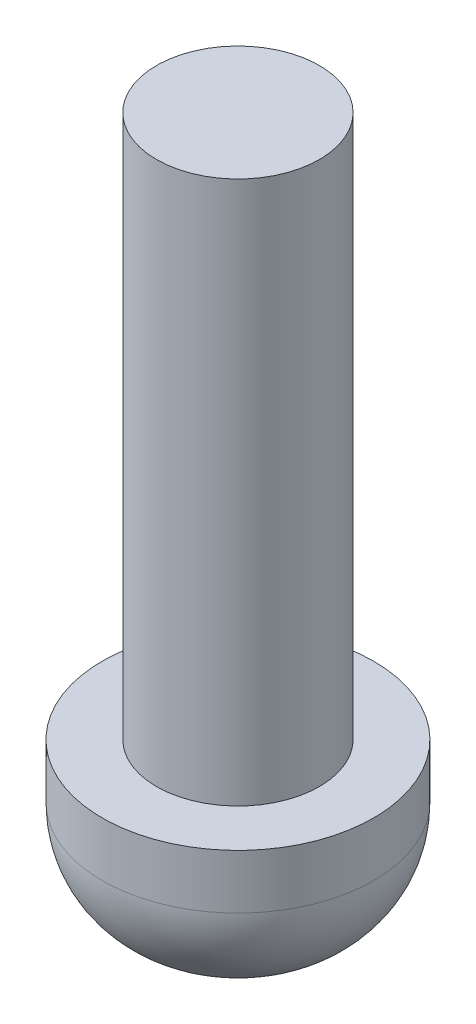
ISO-10303-21;
HEADER;
FILE_DESCRIPTION(('STEP AP214'),'2;1');
FILE_NAME('part.step','',(''),(''),'','','');
FILE_SCHEMA(('AUTOMOTIVE_DESIGN { 1 0 10303 214 1 1 1 1 }'));
ENDSEC;
DATA;
#1=APPLICATION_CONTEXT('core data for automotive mechanical design processes');
#2=APPLICATION_PROTOCOL_DEFINITION('international standard','automotive_design',2000,#1);
#3=PRODUCT_CONTEXT('',#1,'mechanical');
#4=PRODUCT('Part','Part','',(#3));
#5=PRODUCT_RELATED_PRODUCT_CATEGORY('part','',(#4));
#6=PRODUCT_DEFINITION_FORMATION('','',#4);
#7=PRODUCT_DEFINITION_CONTEXT('part definition',#1,'design');
#8=PRODUCT_DEFINITION('design','',#6,#7);
#9=PRODUCT_DEFINITION_SHAPE('','',#8);
#10=(LENGTH_UNIT() NAMED_UNIT(*) SI_UNIT(.MILLI.,.METRE.));
#11=(NAMED_UNIT(*) PLANE_ANGLE_UNIT() SI_UNIT($,.RADIAN.));
#12=(NAMED_UNIT(*) SI_UNIT($,.STERADIAN.) SOLID_ANGLE_UNIT());
#13=UNCERTAINTY_MEASURE_WITH_UNIT(LENGTH_MEASURE(1.E-05),#10,'distance_accuracy_value','');
#14=(GEOMETRIC_REPRESENTATION_CONTEXT(3) GLOBAL_UNCERTAINTY_ASSIGNED_CONTEXT((#13)) GLOBAL_UNIT_ASSIGNED_CONTEXT((#10,
#11,#12)) REPRESENTATION_CONTEXT('',''));
#15=CARTESIAN_POINT('',(0.,0.,0.));
#16=DIRECTION('',(0.,0.,1.));
#17=DIRECTION('',(1.,0.,0.));
#18=AXIS2_PLACEMENT_3D('',#15,#16,#17);
#19=CARTESIAN_POINT('',(0.,-3.,0.));
#20=DIRECTION('',(0.,1.,0.));
#21=DIRECTION('',(0.,0.,1.));
#22=AXIS2_PLACEMENT_3D('',#19,#20,#21);
#23=CYLINDRICAL_SURFACE('',#22,0.5);
#24=CARTESIAN_POINT('',(0.,-3.,0.));
#25=DIRECTION('',(0.,1.,0.));
#26=DIRECTION('',(0.,0.,1.));
#27=AXIS2_PLACEMENT_3D('',#24,#25,#26);
#28=CIRCLE('',#27,0.5);
#29=CARTESIAN_POINT('',(-0.417386632650925,-3.,0.275296928577712));
#30=VERTEX_POINT('',#29);
#31=CARTESIAN_POINT('',(-0.275296928577712,-3.,0.417386632650925));
#32=VERTEX_POINT('',#31);
#33=EDGE_CURVE('E148',#30,#32,#28,.T.);
#34=ORIENTED_EDGE('',*,*,#33,.F.);
#35=DIRECTION('',(0.,1.,0.));
#36=VECTOR('',#35,1.);
#37=CARTESIAN_POINT('',(-0.417386632650925,-3.,0.275296928577712));
#38=LINE('',#37,#36);
#39=CARTESIAN_POINT('',(-0.417386632650925,-1.,0.275296928577712));
#40=VERTEX_POINT('',#39);
#41=EDGE_CURVE('E123',#40,#30,#38,.F.);
#42=ORIENTED_EDGE('',*,*,#41,.F.);
#43=CARTESIAN_POINT('',(0.,-1.,0.));
#44=DIRECTION('',(0.,1.,0.));
#45=DIRECTION('',(0.,0.,1.));
#46=AXIS2_PLACEMENT_3D('',#43,#44,#45);
#47=CIRCLE('',#46,0.5);
#48=CARTESIAN_POINT('',(-0.275296928577712,-1.,0.417386632650925));
#49=VERTEX_POINT('',#48);
#50=EDGE_CURVE('E119',#40,#49,#47,.T.);
#51=ORIENTED_EDGE('',*,*,#50,.T.);
#52=DIRECTION('',(0.,1.,0.));
#53=VECTOR('',#52,1.);
#54=CARTESIAN_POINT('',(-0.275296928577712,-3.,0.417386632650925));
#55=LINE('',#54,#53);
#56=EDGE_CURVE('E124',#49,#32,#55,.F.);
#57=ORIENTED_EDGE('',*,*,#56,.T.);
#58=EDGE_LOOP('',(#34,#42,#51,#57));
#59=FACE_BOUND('',#58,.T.);
#60=ADVANCED_FACE('F17',(#59),#23,.F.);
#61=CARTESIAN_POINT('',(0.,-3.,0.));
#62=DIRECTION('',(0.,1.,0.));
#63=DIRECTION('',(0.,0.,1.));
#64=AXIS2_PLACEMENT_3D('',#61,#62,#63);
#65=CYLINDRICAL_SURFACE('',#64,0.5);
#66=CARTESIAN_POINT('',(0.,-3.,0.));
#67=DIRECTION('',(0.,1.,0.));
#68=DIRECTION('',(0.,0.,1.));
#69=AXIS2_PLACEMENT_3D('',#66,#67,#68);
#70=CIRCLE('',#69,0.5);
#71=CARTESIAN_POINT('',(-0.275296928577712,-3.,-0.417386632650925));
#72=VERTEX_POINT('',#71);
#73=CARTESIAN_POINT('',(-0.417386632650925,-3.,-0.275296928577712));
#74=VERTEX_POINT('',#73);
#75=EDGE_CURVE('E142',#72,#74,#70,.T.);
#76=ORIENTED_EDGE('',*,*,#75,.F.);
#77=DIRECTION('',(0.,1.,0.));
#78=VECTOR('',#77,1.);
#79=CARTESIAN_POINT('',(-0.275296928577712,-3.,-0.417386632650925));
#80=LINE('',#79,#78);
#81=CARTESIAN_POINT('',(-0.275296928577712,-1.,-0.417386632650925));
#82=VERTEX_POINT('',#81);
#83=EDGE_CURVE('E256',#82,#72,#80,.F.);
#84=ORIENTED_EDGE('',*,*,#83,.F.);
#85=CARTESIAN_POINT('',(0.,-1.,0.));
#86=DIRECTION('',(0.,1.,0.));
#87=DIRECTION('',(0.,0.,1.));
#88=AXIS2_PLACEMENT_3D('',#85,#86,#87);
#89=CIRCLE('',#88,0.5);
#90=CARTESIAN_POINT('',(-0.417386632650925,-1.,-0.275296928577712));
#91=VERTEX_POINT('',#90);
#92=EDGE_CURVE('E238',#82,#91,#89,.T.);
#93=ORIENTED_EDGE('',*,*,#92,.T.);
#94=DIRECTION('',(0.,1.,0.));
#95=VECTOR('',#94,1.);
#96=CARTESIAN_POINT('',(-0.417386632650925,-3.,-0.275296928577712));
#97=LINE('',#96,#95);
#98=EDGE_CURVE('E137',#91,#74,#97,.F.);
#99=ORIENTED_EDGE('',*,*,#98,.T.);
#100=EDGE_LOOP('',(#76,#84,#93,#99));
#101=FACE_BOUND('',#100,.T.);
#102=ADVANCED_FACE('F322',(#101),#65,.F.);
#103=CARTESIAN_POINT('',(0.,-3.,0.));
#104=DIRECTION('',(0.,1.,0.));
#105=DIRECTION('',(0.,0.,1.));
#106=AXIS2_PLACEMENT_3D('',#103,#104,#105);
#107=CYLINDRICAL_SURFACE('',#106,0.5);
#108=CARTESIAN_POINT('',(0.,-1.,0.));
#109=DIRECTION('',(0.,1.,0.));
#110=DIRECTION('',(0.,0.,1.));
#111=AXIS2_PLACEMENT_3D('',#108,#109,#110);
#112=CIRCLE('',#111,0.5);
#113=CARTESIAN_POINT('',(0.417386632650925,-1.,-0.275296928577712));
#114=VERTEX_POINT('',#113);
#115=CARTESIAN_POINT('',(0.275296928577712,-1.,-0.417386632650925));
#116=VERTEX_POINT('',#115);
#117=EDGE_CURVE('E22',#114,#116,#112,.T.);
#118=ORIENTED_EDGE('',*,*,#117,.T.);
#119=DIRECTION('',(0.,1.,0.));
#120=VECTOR('',#119,1.);
#121=CARTESIAN_POINT('',(0.275296928577712,-3.,-0.417386632650925));
#122=LINE('',#121,#120);
#123=CARTESIAN_POINT('',(0.275296928577712,-3.,-0.417386632650925));
#124=VERTEX_POINT('',#123);
#125=EDGE_CURVE('E252',#116,#124,#122,.F.);
#126=ORIENTED_EDGE('',*,*,#125,.T.);
#127=CARTESIAN_POINT('',(0.,-3.,0.));
#128=DIRECTION('',(0.,1.,0.));
#129=DIRECTION('',(0.,0.,1.));
#130=AXIS2_PLACEMENT_3D('',#127,#128,#129);
#131=CIRCLE('',#130,0.5);
#132=CARTESIAN_POINT('',(0.417386632650925,-3.,-0.275296928577712));
#133=VERTEX_POINT('',#132);
#134=EDGE_CURVE('E241',#133,#124,#131,.T.);
#135=ORIENTED_EDGE('',*,*,#134,.F.);
#136=DIRECTION('',(0.,1.,0.));
#137=VECTOR('',#136,1.);
#138=CARTESIAN_POINT('',(0.417386632650925,-3.,-0.275296928577712));
#139=LINE('',#138,#137);
#140=EDGE_CURVE('E287',#114,#133,#139,.F.);
#141=ORIENTED_EDGE('',*,*,#140,.F.);
#142=EDGE_LOOP('',(#118,#126,#135,#141));
#143=FACE_BOUND('',#142,.T.);
#144=ADVANCED_FACE('F320',(#143),#107,.F.);
#145=CARTESIAN_POINT('',(-0.0764702213901551,-1.,1.11261669727155));
#146=DIRECTION('',(0.,1.,0.));
#147=DIRECTION('',(0.,0.,1.));
#148=AXIS2_PLACEMENT_3D('',#145,#146,#147);
#149=PLANE('',#148);
#150=DIRECTION('',(0.186616509751668,0.,0.982432836527824));
#151=VECTOR('',#150,1.);
#152=CARTESIAN_POINT('',(-0.275296928577712,-1.,0.417386632650924));
#153=LINE('',#152,#151);
#154=CARTESIAN_POINT('',(0.,-1.,1.86667288706595));
#155=VERTEX_POINT('',#154);
#156=EDGE_CURVE('E237',#155,#49,#153,.F.);
#157=ORIENTED_EDGE('',*,*,#156,.T.);
#158=ORIENTED_EDGE('',*,*,#50,.F.);
#159=DIRECTION('',(-0.982432836527824,0.,-0.186616509751668));
#160=VECTOR('',#159,1.);
#161=CARTESIAN_POINT('',(-0.417386632650924,-1.,0.275296928577712));
#162=LINE('',#161,#160);
#163=CARTESIAN_POINT('',(-1.86667288706595,-1.,0.));
#164=VERTEX_POINT('',#163);
#165=EDGE_CURVE('E112',#164,#40,#162,.F.);
#166=ORIENTED_EDGE('',*,*,#165,.F.);
#167=DIRECTION('',(-0.982432836527824,0.,0.186616509751668));
#168=VECTOR('',#167,1.);
#169=CARTESIAN_POINT('',(-0.417386632650924,-1.,-0.275296928577712));
#170=LINE('',#169,#168);
#171=EDGE_CURVE('E117',#164,#91,#170,.F.);
#172=ORIENTED_EDGE('',*,*,#171,.T.);
#173=ORIENTED_EDGE('',*,*,#92,.F.);
#174=DIRECTION('',(0.186616509751668,0.,-0.982432836527824));
#175=VECTOR('',#174,1.);
#176=CARTESIAN_POINT('',(-0.275296928577712,-1.,-0.417386632650924));
#177=LINE('',#176,#175);
#178=CARTESIAN_POINT('',(0.,-1.,-1.86667288706595));
#179=VERTEX_POINT('',#178);
#180=EDGE_CURVE('E107',#179,#82,#177,.F.);
#181=ORIENTED_EDGE('',*,*,#180,.F.);
#182=DIRECTION('',(-0.186616509751668,0.,-0.982432836527824));
#183=VECTOR('',#182,1.);
#184=CARTESIAN_POINT('',(0.275296928577712,-1.,-0.417386632650924));
#185=LINE('',#184,#183);
#186=EDGE_CURVE('E250',#179,#116,#185,.F.);
#187=ORIENTED_EDGE('',*,*,#186,.T.);
#188=ORIENTED_EDGE('',*,*,#117,.F.);
#189=DIRECTION('',(0.982432836527824,0.,0.186616509751668));
#190=VECTOR('',#189,1.);
#191=CARTESIAN_POINT('',(0.417386632650924,-1.,-0.275296928577712));
#192=LINE('',#191,#190);
#193=CARTESIAN_POINT('',(1.86667288706595,-1.,0.));
#194=VERTEX_POINT('',#193);
#195=EDGE_CURVE('E285',#194,#114,#192,.F.);
#196=ORIENTED_EDGE('',*,*,#195,.F.);
#197=DIRECTION('',(0.982432836527824,0.,-0.186616509751668));
#198=VECTOR('',#197,1.);
#199=CARTESIAN_POINT('',(0.417386632650924,-1.,0.275296928577712));
#200=LINE('',#199,#198);
#201=CARTESIAN_POINT('',(0.417386632650925,-1.,0.275296928577712));
#202=VERTEX_POINT('',#201);
#203=EDGE_CURVE('E280',#194,#202,#200,.F.);
#204=ORIENTED_EDGE('',*,*,#203,.T.);
#205=CARTESIAN_POINT('',(0.,-1.,0.));
#206=DIRECTION('',(0.,1.,0.));
#207=DIRECTION('',(0.,0.,1.));
#208=AXIS2_PLACEMENT_3D('',#205,#206,#207);
#209=CIRCLE('',#208,0.5);
#210=CARTESIAN_POINT('',(0.275296928577712,-1.,0.417386632650925));
#211=VERTEX_POINT('',#210);
#212=EDGE_CURVE('E235',#202,#211,#209,.F.);
#213=ORIENTED_EDGE('',*,*,#212,.T.);
#214=DIRECTION('',(-0.186616509751667,0.,0.982432836527824));
#215=VECTOR('',#214,1.);
#216=CARTESIAN_POINT('',(0.275296928577712,-1.,0.417386632650924));
#217=LINE('',#216,#215);
#218=EDGE_CURVE('E271',#155,#211,#217,.F.);
#219=ORIENTED_EDGE('',*,*,#218,.F.);
#220=EDGE_LOOP('',(#157,#158,#166,#172,#173,#181,#187,#188,#196,#204,#213,#219));
#221=FACE_BOUND('',#220,.T.);
#222=ADVANCED_FACE('F115',(#221),#149,.F.);
#223=CARTESIAN_POINT('',(0.,-3.,0.));
#224=DIRECTION('',(0.,1.,0.));
#225=DIRECTION('',(0.,0.,1.));
#226=AXIS2_PLACEMENT_3D('',#223,#224,#225);
#227=CYLINDRICAL_SURFACE('',#226,0.5);
#228=ORIENTED_EDGE('',*,*,#212,.F.);
#229=DIRECTION('',(0.,1.,0.));
#230=VECTOR('',#229,1.);
#231=CARTESIAN_POINT('',(0.417386632650925,-3.,0.275296928577712));
#232=LINE('',#231,#230);
#233=CARTESIAN_POINT('',(0.417386632650925,-3.,0.275296928577712));
#234=VERTEX_POINT('',#233);
#235=EDGE_CURVE('E282',#202,#234,#232,.F.);
#236=ORIENTED_EDGE('',*,*,#235,.T.);
#237=CARTESIAN_POINT('',(0.,-3.,0.));
#238=DIRECTION('',(0.,1.,0.));
#239=DIRECTION('',(0.,0.,1.));
#240=AXIS2_PLACEMENT_3D('',#237,#238,#239);
#241=CIRCLE('',#240,0.5);
#242=CARTESIAN_POINT('',(0.275296928577712,-3.,0.417386632650925));
#243=VERTEX_POINT('',#242);
#244=EDGE_CURVE('E37',#243,#234,#241,.T.);
#245=ORIENTED_EDGE('',*,*,#244,.F.);
#246=DIRECTION('',(0.,1.,0.));
#247=VECTOR('',#246,1.);
#248=CARTESIAN_POINT('',(0.275296928577712,-3.,0.417386632650925));
#249=LINE('',#248,#247);
#250=EDGE_CURVE('E234',#211,#243,#249,.F.);
#251=ORIENTED_EDGE('',*,*,#250,.F.);
#252=EDGE_LOOP('',(#228,#236,#245,#251));
#253=FACE_BOUND('',#252,.T.);
#254=ADVANCED_FACE('F317',(#253),#227,.F.);
#255=CARTESIAN_POINT('',(-0.275296928577712,-3.,0.417386632650924));
#256=DIRECTION('',(-0.982432836527824,0.,0.186616509751668));
#257=DIRECTION('',(0.186616509751668,0.,0.982432836527824));
#258=AXIS2_PLACEMENT_3D('',#255,#256,#257);
#259=PLANE('',#258);
#260=ORIENTED_EDGE('',*,*,#56,.F.);
#261=ORIENTED_EDGE('',*,*,#156,.F.);
#262=DIRECTION('',(0.,1.,0.));
#263=VECTOR('',#262,1.);
#264=CARTESIAN_POINT('',(0.,-3.,1.86667288706595));
#265=LINE('',#264,#263);
#266=CARTESIAN_POINT('',(0.,-2.46020725233058,1.86667288706595));
#267=VERTEX_POINT('',#266);
#268=EDGE_CURVE('E274',#267,#155,#265,.T.);
#269=ORIENTED_EDGE('',*,*,#268,.F.);
#270=CARTESIAN_POINT('',(0.,-2.46020725233058,1.86667288706595));
#271=CARTESIAN_POINT('',(-0.00776142539482357,-2.49845915486976,1.82581326978834));
#272=CARTESIAN_POINT('',(-0.0158277073003401,-2.53493116108651,1.78334875138525));
#273=CARTESIAN_POINT('',(-0.0325059050546486,-2.60408300695784,1.69554725327696));
#274=CARTESIAN_POINT('',(-0.0411177378060531,-2.6367634220043,1.6502107110336));
#275=CARTESIAN_POINT('',(-0.0587790152620792,-2.69795093014662,1.55723384135086));
#276=CARTESIAN_POINT('',(-0.0678259336451282,-2.72647897071327,1.50960681359901));
#277=CARTESIAN_POINT('',(-0.0863325054746453,-2.77938738063862,1.41217993598206));
#278=CARTESIAN_POINT('',(-0.0957921573048897,-2.8037677662373,1.36238009462548));
#279=CARTESIAN_POINT('',(-0.115083201530185,-2.84830926803169,1.2608234031888));
#280=CARTESIAN_POINT('',(-0.124915581236441,-2.86845809697933,1.2090613554606));
#281=CARTESIAN_POINT('',(-0.14485564102163,-2.90436819161545,1.1040879556185));
#282=CARTESIAN_POINT('',(-0.154963333493496,-2.92012925943369,1.05087653826266));
#283=CARTESIAN_POINT('',(-0.175387573669657,-2.94726351717147,0.943354196124276));
#284=CARTESIAN_POINT('',(-0.185704246218149,-2.9586339976211,0.889042614105991));
#285=CARTESIAN_POINT('',(-0.206467124357516,-2.97708174407899,0.779737530155575));
#286=CARTESIAN_POINT('',(-0.216913296807874,-2.98416008625995,0.724744202689956));
#287=CARTESIAN_POINT('',(-0.235364007745588,-2.99311272496978,0.627611401810682));
#288=CARTESIAN_POINT('',(-0.243355243140343,-2.99582657895604,0.585541961830921));
#289=CARTESIAN_POINT('',(-0.259330976805921,-2.99929022162117,0.501438549107298));
#290=CARTESIAN_POINT('',(-0.267315433023205,-3.00004539864414,0.459404797752087));
#291=CARTESIAN_POINT('',(-0.275296928577712,-3.,0.417386632650925));
#292=B_SPLINE_CURVE_WITH_KNOTS('',3,(#270,#271,#272,#273,#274,#275,#276,#277,#278,#279,#280,
#281,#282,#283,#284,#285,#286,#287,#288,#289,#290,#291),.UNSPECIFIED.,.F.,.F.,(4,2,2,2,2,2,2,2,
2,2,4),(0.,0.169464193073183,0.338902635422565,0.507454255729412,0.676005216063944,
0.845039033198092,1.01408047183784,1.18322606134826,1.35232922323803,1.48100627474123,
1.60932895680656),.UNSPECIFIED.);
#293=EDGE_CURVE('E228',#267,#32,#292,.T.);
#294=ORIENTED_EDGE('',*,*,#293,.T.);
#295=EDGE_LOOP('',(#260,#261,#269,#294));
#296=FACE_BOUND('',#295,.T.);
#297=ADVANCED_FACE('F221',(#296),#259,.F.);
#298=CARTESIAN_POINT('',(-0.417386632650924,-3.,0.275296928577712));
#299=DIRECTION('',(0.186616509751668,0.,-0.982432836527824));
#300=DIRECTION('',(-0.982432836527824,0.,-0.186616509751668));
#301=AXIS2_PLACEMENT_3D('',#298,#299,#300);
#302=PLANE('',#301);
#303=ORIENTED_EDGE('',*,*,#165,.T.);
#304=ORIENTED_EDGE('',*,*,#41,.T.);
#305=CARTESIAN_POINT('',(-0.417386632650925,-3.,0.275296928577712));
#306=CARTESIAN_POINT('',(-0.45845868800384,-3.00004250047312,0.26749514983691));
#307=CARTESIAN_POINT('',(-0.499547300384007,-2.9993223050727,0.259690226031609));
#308=CARTESIAN_POINT('',(-0.581669686186093,-2.9960274229699,0.24409079527049));
#309=CARTESIAN_POINT('',(-0.622703424611833,-2.99345186193378,0.236296294962318));
#310=CARTESIAN_POINT('',(-0.704754032335398,-2.98610172067789,0.220710498695072));
#311=CARTESIAN_POINT('',(-0.74577016840546,-2.98131832763566,0.212919342015144));
#312=CARTESIAN_POINT('',(-0.827469814840993,-2.96941444831103,0.19740021205647));
#313=CARTESIAN_POINT('',(-0.868153343500296,-2.96229409146309,0.189672235302747));
#314=CARTESIAN_POINT('',(-0.964704281794939,-2.94240753600433,0.171332051172221));
#315=CARTESIAN_POINT('',(-1.02035573491331,-2.9285228137521,0.160760865481538));
#316=CARTESIAN_POINT('',(-1.13032414423563,-2.89605250685143,0.13987198639724));
#317=CARTESIAN_POINT('',(-1.18464045616055,-2.87746469973623,0.129554415386649));
#318=CARTESIAN_POINT('',(-1.34471680761753,-2.81477291091843,0.0991473596654045));
#319=CARTESIAN_POINT('',(-1.44796400356674,-2.76366752019459,0.079535198270449));
#320=CARTESIAN_POINT('',(-1.60332914889236,-2.66899490474447,0.0500230524221886));
#321=CARTESIAN_POINT('',(-1.6588844484557,-2.63110050167444,0.0394701314313148));
#322=CARTESIAN_POINT('',(-1.76594722456691,-2.54974211056431,0.0191331874089514));
#323=CARTESIAN_POINT('',(-1.81745286535616,-2.50627561984794,0.00934951308615187));
#324=CARTESIAN_POINT('',(-1.86667288706595,-2.46020725233058,0.));
#325=B_SPLINE_CURVE_WITH_KNOTS('',3,(#305,#306,#307,#308,#309,#310,#311,#312,#313,#314,#315,
#316,#317,#318,#319,#320,#321,#322,#323,#324),.UNSPECIFIED.,.F.,.F.,(4,2,2,2,2,2,2,2,2,4),(0.,
0.125436918354253,0.250932987062504,0.376934378856967,0.502928793149234,0.677675217230228,
0.852504373357275,1.20105629115214,1.40496381365719,1.6089632432446),.UNSPECIFIED.);
#326=CARTESIAN_POINT('',(-1.86667288706595,-2.46020725233058,0.));
#327=VERTEX_POINT('',#326);
#328=EDGE_CURVE('E130',#30,#327,#325,.T.);
#329=ORIENTED_EDGE('',*,*,#328,.T.);
#330=DIRECTION('',(0.,1.,0.));
#331=VECTOR('',#330,1.);
#332=CARTESIAN_POINT('',(-1.86667288706595,-3.,0.));
#333=LINE('',#332,#331);
#334=EDGE_CURVE('E127',#327,#164,#333,.T.);
#335=ORIENTED_EDGE('',*,*,#334,.T.);
#336=EDGE_LOOP('',(#303,#304,#329,#335));
#337=FACE_BOUND('',#336,.T.);
#338=ADVANCED_FACE('F128',(#337),#302,.T.);
#339=CARTESIAN_POINT('',(-0.417386632650924,-3.,-0.275296928577712));
#340=DIRECTION('',(-0.186616509751668,0.,-0.982432836527824));
#341=DIRECTION('',(-0.982432836527824,0.,0.186616509751668));
#342=AXIS2_PLACEMENT_3D('',#339,#340,#341);
#343=PLANE('',#342);
#344=ORIENTED_EDGE('',*,*,#98,.F.);
#345=ORIENTED_EDGE('',*,*,#171,.F.);
#346=ORIENTED_EDGE('',*,*,#334,.F.);
#347=CARTESIAN_POINT('',(-1.86667288706595,-2.46020725233058,0.));
#348=CARTESIAN_POINT('',(-1.82581326978834,-2.49845915486976,-0.00776142539482368));
#349=CARTESIAN_POINT('',(-1.78334875138525,-2.53493116108651,-0.0158277073003402));
#350=CARTESIAN_POINT('',(-1.69554725327696,-2.60408300695784,-0.0325059050546486));
#351=CARTESIAN_POINT('',(-1.6502107110336,-2.6367634220043,-0.0411177378060531));
#352=CARTESIAN_POINT('',(-1.55723384135086,-2.69795093014662,-0.0587790152620793));
#353=CARTESIAN_POINT('',(-1.50960681359901,-2.72647897071327,-0.0678259336451284));
#354=CARTESIAN_POINT('',(-1.41217993598206,-2.77938738063862,-0.0863325054746455));
#355=CARTESIAN_POINT('',(-1.36238009462548,-2.8037677662373,-0.0957921573048899));
#356=CARTESIAN_POINT('',(-1.2608234031888,-2.84830926803169,-0.115083201530185));
#357=CARTESIAN_POINT('',(-1.2090613554606,-2.86845809697933,-0.124915581236441));
#358=CARTESIAN_POINT('',(-1.1040879556185,-2.90436819161545,-0.144855641021631));
#359=CARTESIAN_POINT('',(-1.05087653826266,-2.92012925943369,-0.154963333493497));
#360=CARTESIAN_POINT('',(-0.943354196124275,-2.94726351717147,-0.175387573669657));
#361=CARTESIAN_POINT('',(-0.889042614105991,-2.9586339976211,-0.185704246218149));
#362=CARTESIAN_POINT('',(-0.779737530155574,-2.97708174407899,-0.206467124357516));
#363=CARTESIAN_POINT('',(-0.724744202689955,-2.98416008625995,-0.216913296807874));
#364=CARTESIAN_POINT('',(-0.627611401810681,-2.99311272496978,-0.235364007745589));
#365=CARTESIAN_POINT('',(-0.58554196183092,-2.99582657895604,-0.243355243140343));
#366=CARTESIAN_POINT('',(-0.501438549107298,-2.99929022162117,-0.259330976805921));
#367=CARTESIAN_POINT('',(-0.459404797752087,-3.00004539864414,-0.267315433023205));
#368=CARTESIAN_POINT('',(-0.417386632650925,-3.,-0.275296928577712));
#369=B_SPLINE_CURVE_WITH_KNOTS('',3,(#347,#348,#349,#350,#351,#352,#353,#354,#355,#356,#357,
#358,#359,#360,#361,#362,#363,#364,#365,#366,#367,#368),.UNSPECIFIED.,.F.,.F.,(4,2,2,2,2,2,2,2,
2,2,4),(0.,0.169464193073183,0.338902635422565,0.507454255729412,0.676005216063944,
0.845039033198093,1.01408047183784,1.18322606134826,1.35232922323803,1.48100627474123,
1.60932895680656),.UNSPECIFIED.);
#370=EDGE_CURVE('E205',#327,#74,#369,.T.);
#371=ORIENTED_EDGE('',*,*,#370,.T.);
#372=EDGE_LOOP('',(#344,#345,#346,#371));
#373=FACE_BOUND('',#372,.T.);
#374=ADVANCED_FACE('F135',(#373),#343,.F.);
#375=CARTESIAN_POINT('',(-0.275296928577712,-3.,-0.417386632650924));
#376=DIRECTION('',(0.982432836527824,0.,0.186616509751668));
#377=DIRECTION('',(0.186616509751668,0.,-0.982432836527824));
#378=AXIS2_PLACEMENT_3D('',#375,#376,#377);
#379=PLANE('',#378);
#380=ORIENTED_EDGE('',*,*,#180,.T.);
#381=ORIENTED_EDGE('',*,*,#83,.T.);
#382=CARTESIAN_POINT('',(-0.275296928577712,-3.,-0.417386632650925));
#383=CARTESIAN_POINT('',(-0.26749514983691,-3.00004250047312,-0.45845868800384));
#384=CARTESIAN_POINT('',(-0.259690226031609,-2.9993223050727,-0.499547300384007));
#385=CARTESIAN_POINT('',(-0.24409079527049,-2.9960274229699,-0.581669686186093));
#386=CARTESIAN_POINT('',(-0.236296294962318,-2.99345186193378,-0.622703424611832));
#387=CARTESIAN_POINT('',(-0.220710498695072,-2.98610172067789,-0.704754032335398));
#388=CARTESIAN_POINT('',(-0.212919342015144,-2.98131832763566,-0.74577016840546));
#389=CARTESIAN_POINT('',(-0.19740021205647,-2.96941444831103,-0.827469814840992));
#390=CARTESIAN_POINT('',(-0.189672235302747,-2.96229409146309,-0.868153343500295));
#391=CARTESIAN_POINT('',(-0.171332051172221,-2.94240753600433,-0.964704281794938));
#392=CARTESIAN_POINT('',(-0.160760865481538,-2.9285228137521,-1.02035573491331));
#393=CARTESIAN_POINT('',(-0.13987198639724,-2.89605250685143,-1.13032414423563));
#394=CARTESIAN_POINT('',(-0.12955441538665,-2.87746469973623,-1.18464045616055));
#395=CARTESIAN_POINT('',(-0.0991473596654047,-2.81477291091844,-1.34471680761753));
#396=CARTESIAN_POINT('',(-0.0795351982704491,-2.76366752019459,-1.44796400356674));
#397=CARTESIAN_POINT('',(-0.0500230524221886,-2.66899490474447,-1.60332914889236));
#398=CARTESIAN_POINT('',(-0.0394701314313147,-2.63110050167444,-1.6588844484557));
#399=CARTESIAN_POINT('',(-0.0191331874089513,-2.54974211056432,-1.76594722456691));
#400=CARTESIAN_POINT('',(-0.00934951308615183,-2.50627561984794,-1.81745286535616));
#401=CARTESIAN_POINT('',(0.,-2.46020725233058,-1.86667288706595));
#402=B_SPLINE_CURVE_WITH_KNOTS('',3,(#382,#383,#384,#385,#386,#387,#388,#389,#390,#391,#392,
#393,#394,#395,#396,#397,#398,#399,#400,#401),.UNSPECIFIED.,.F.,.F.,(4,2,2,2,2,2,2,2,2,4),(0.,
0.125436918354253,0.250932987062503,0.376934378856966,0.502928793149233,0.677675217230228,
0.852504373357274,1.20105629115214,1.40496381365719,1.6089632432446),.UNSPECIFIED.);
#403=CARTESIAN_POINT('',(0.,-2.46020725233058,-1.86667288706595));
#404=VERTEX_POINT('',#403);
#405=EDGE_CURVE('E200',#72,#404,#402,.T.);
#406=ORIENTED_EDGE('',*,*,#405,.T.);
#407=DIRECTION('',(0.,1.,0.));
#408=VECTOR('',#407,1.);
#409=CARTESIAN_POINT('',(0.,-3.,-1.86667288706595));
#410=LINE('',#409,#408);
#411=EDGE_CURVE('E253',#404,#179,#410,.T.);
#412=ORIENTED_EDGE('',*,*,#411,.T.);
#413=EDGE_LOOP('',(#380,#381,#406,#412));
#414=FACE_BOUND('',#413,.T.);
#415=ADVANCED_FACE('F211',(#414),#379,.T.);
#416=CARTESIAN_POINT('',(0.275296928577712,-3.,-0.417386632650924));
#417=DIRECTION('',(0.982432836527824,0.,-0.186616509751668));
#418=DIRECTION('',(-0.186616509751668,0.,-0.982432836527824));
#419=AXIS2_PLACEMENT_3D('',#416,#417,#418);
#420=PLANE('',#419);
#421=ORIENTED_EDGE('',*,*,#125,.F.);
#422=ORIENTED_EDGE('',*,*,#186,.F.);
#423=ORIENTED_EDGE('',*,*,#411,.F.);
#424=CARTESIAN_POINT('',(0.,-2.46020725233058,-1.86667288706595));
#425=CARTESIAN_POINT('',(0.00776142539482352,-2.49845915486976,-1.82581326978834));
#426=CARTESIAN_POINT('',(0.0158277073003401,-2.53493116108651,-1.78334875138525));
#427=CARTESIAN_POINT('',(0.0325059050546485,-2.60408300695784,-1.69554725327696));
#428=CARTESIAN_POINT('',(0.0411177378060531,-2.6367634220043,-1.6502107110336));
#429=CARTESIAN_POINT('',(0.0587790152620793,-2.69795093014662,-1.55723384135086));
#430=CARTESIAN_POINT('',(0.0678259336451283,-2.72647897071327,-1.50960681359901));
#431=CARTESIAN_POINT('',(0.0863325054746454,-2.77938738063862,-1.41217993598206));
#432=CARTESIAN_POINT('',(0.0957921573048898,-2.8037677662373,-1.36238009462548));
#433=CARTESIAN_POINT('',(0.115083201530185,-2.84830926803169,-1.2608234031888));
#434=CARTESIAN_POINT('',(0.124915581236441,-2.86845809697933,-1.2090613554606));
#435=CARTESIAN_POINT('',(0.144855641021631,-2.90436819161545,-1.1040879556185));
#436=CARTESIAN_POINT('',(0.154963333493497,-2.92012925943369,-1.05087653826266));
#437=CARTESIAN_POINT('',(0.175387573669657,-2.94726351717147,-0.943354196124275));
#438=CARTESIAN_POINT('',(0.185704246218149,-2.9586339976211,-0.889042614105991));
#439=CARTESIAN_POINT('',(0.206467124357516,-2.97708174407899,-0.779737530155574));
#440=CARTESIAN_POINT('',(0.216913296807874,-2.98416008625995,-0.724744202689955));
#441=CARTESIAN_POINT('',(0.235364007745589,-2.99311272496978,-0.627611401810681));
#442=CARTESIAN_POINT('',(0.243355243140343,-2.99582657895604,-0.58554196183092));
#443=CARTESIAN_POINT('',(0.259330976805921,-2.99929022162117,-0.501438549107298));
#444=CARTESIAN_POINT('',(0.267315433023205,-3.00004539864414,-0.459404797752087));
#445=CARTESIAN_POINT('',(0.275296928577712,-3.,-0.417386632650925));
#446=B_SPLINE_CURVE_WITH_KNOTS('',3,(#424,#425,#426,#427,#428,#429,#430,#431,#432,#433,#434,
#435,#436,#437,#438,#439,#440,#441,#442,#443,#444,#445),.UNSPECIFIED.,.F.,.F.,(4,2,2,2,2,2,2,2,
2,2,4),(0.,0.169464193073183,0.338902635422565,0.507454255729412,0.676005216063944,
0.845039033198093,1.01408047183784,1.18322606134826,1.35232922323804,1.48100627474123,
1.60932895680656),.UNSPECIFIED.);
#447=EDGE_CURVE('E194',#404,#124,#446,.T.);
#448=ORIENTED_EDGE('',*,*,#447,.T.);
#449=EDGE_LOOP('',(#421,#422,#423,#448));
#450=FACE_BOUND('',#449,.T.);
#451=ADVANCED_FACE('F185',(#450),#420,.F.);
#452=CARTESIAN_POINT('',(0.417386632650924,-3.,-0.275296928577712));
#453=DIRECTION('',(-0.186616509751668,0.,0.982432836527824));
#454=DIRECTION('',(0.982432836527824,0.,0.186616509751668));
#455=AXIS2_PLACEMENT_3D('',#452,#453,#454);
#456=PLANE('',#455);
#457=ORIENTED_EDGE('',*,*,#195,.T.);
#458=ORIENTED_EDGE('',*,*,#140,.T.);
#459=CARTESIAN_POINT('',(0.417386632650925,-3.,-0.275296928577712));
#460=CARTESIAN_POINT('',(0.45845868800384,-3.00004250047312,-0.26749514983691));
#461=CARTESIAN_POINT('',(0.499547300384007,-2.9993223050727,-0.259690226031609));
#462=CARTESIAN_POINT('',(0.581669686186093,-2.9960274229699,-0.24409079527049));
#463=CARTESIAN_POINT('',(0.622703424611832,-2.99345186193378,-0.236296294962318));
#464=CARTESIAN_POINT('',(0.704754032335398,-2.98610172067789,-0.220710498695072));
#465=CARTESIAN_POINT('',(0.74577016840546,-2.98131832763566,-0.212919342015144));
#466=CARTESIAN_POINT('',(0.827469814840992,-2.96941444831103,-0.19740021205647));
#467=CARTESIAN_POINT('',(0.868153343500295,-2.96229409146309,-0.189672235302747));
#468=CARTESIAN_POINT('',(0.964704281794938,-2.94240753600433,-0.171332051172221));
#469=CARTESIAN_POINT('',(1.02035573491331,-2.9285228137521,-0.160760865481538));
#470=CARTESIAN_POINT('',(1.13032414423563,-2.89605250685143,-0.13987198639724));
#471=CARTESIAN_POINT('',(1.18464045616055,-2.87746469973623,-0.12955441538665));
#472=CARTESIAN_POINT('',(1.34471680761753,-2.81477291091844,-0.0991473596654047));
#473=CARTESIAN_POINT('',(1.44796400356674,-2.76366752019459,-0.0795351982704491));
#474=CARTESIAN_POINT('',(1.60332914889236,-2.66899490474447,-0.0500230524221886));
#475=CARTESIAN_POINT('',(1.6588844484557,-2.63110050167444,-0.0394701314313147));
#476=CARTESIAN_POINT('',(1.76594722456691,-2.54974211056431,-0.0191331874089513));
#477=CARTESIAN_POINT('',(1.81745286535616,-2.50627561984794,-0.00934951308615182));
#478=CARTESIAN_POINT('',(1.86667288706595,-2.46020725233058,0.));
#479=B_SPLINE_CURVE_WITH_KNOTS('',3,(#459,#460,#461,#462,#463,#464,#465,#466,#467,#468,#469,
#470,#471,#472,#473,#474,#475,#476,#477,#478),.UNSPECIFIED.,.F.,.F.,(4,2,2,2,2,2,2,2,2,4),(0.,
0.125436918354253,0.250932987062503,0.376934378856966,0.502928793149233,0.677675217230228,
0.852504373357274,1.20105629115214,1.40496381365719,1.6089632432446),.UNSPECIFIED.);
#480=CARTESIAN_POINT('',(1.86667288706595,-2.46020725233058,0.));
#481=VERTEX_POINT('',#480);
#482=EDGE_CURVE('E189',#133,#481,#479,.T.);
#483=ORIENTED_EDGE('',*,*,#482,.T.);
#484=DIRECTION('',(0.,1.,0.));
#485=VECTOR('',#484,1.);
#486=CARTESIAN_POINT('',(1.86667288706595,-3.,0.));
#487=LINE('',#486,#485);
#488=EDGE_CURVE('E283',#481,#194,#487,.T.);
#489=ORIENTED_EDGE('',*,*,#488,.T.);
#490=EDGE_LOOP('',(#457,#458,#483,#489));
#491=FACE_BOUND('',#490,.T.);
#492=ADVANCED_FACE('F180',(#491),#456,.T.);
#493=CARTESIAN_POINT('',(0.417386632650924,-3.,0.275296928577712));
#494=DIRECTION('',(0.186616509751668,0.,0.982432836527824));
#495=DIRECTION('',(0.982432836527824,0.,-0.186616509751668));
#496=AXIS2_PLACEMENT_3D('',#493,#494,#495);
#497=PLANE('',#496);
#498=ORIENTED_EDGE('',*,*,#235,.F.);
#499=ORIENTED_EDGE('',*,*,#203,.F.);
#500=ORIENTED_EDGE('',*,*,#488,.F.);
#501=CARTESIAN_POINT('',(1.86667288706595,-2.46020725233058,0.));
#502=CARTESIAN_POINT('',(1.82581326978834,-2.49845915486976,0.00776142539482352));
#503=CARTESIAN_POINT('',(1.78334875138525,-2.53493116108651,0.0158277073003401));
#504=CARTESIAN_POINT('',(1.69554725327696,-2.60408300695784,0.0325059050546485));
#505=CARTESIAN_POINT('',(1.6502107110336,-2.6367634220043,0.0411177378060531));
#506=CARTESIAN_POINT('',(1.55723384135086,-2.69795093014662,0.0587790152620793));
#507=CARTESIAN_POINT('',(1.50960681359901,-2.72647897071327,0.0678259336451284));
#508=CARTESIAN_POINT('',(1.41217993598206,-2.77938738063862,0.0863325054746455));
#509=CARTESIAN_POINT('',(1.36238009462548,-2.8037677662373,0.0957921573048899));
#510=CARTESIAN_POINT('',(1.2608234031888,-2.84830926803169,0.115083201530186));
#511=CARTESIAN_POINT('',(1.2090613554606,-2.86845809697933,0.124915581236441));
#512=CARTESIAN_POINT('',(1.1040879556185,-2.90436819161545,0.144855641021631));
#513=CARTESIAN_POINT('',(1.05087653826266,-2.92012925943369,0.154963333493497));
#514=CARTESIAN_POINT('',(0.943354196124275,-2.94726351717147,0.175387573669657));
#515=CARTESIAN_POINT('',(0.88904261410599,-2.9586339976211,0.185704246218149));
#516=CARTESIAN_POINT('',(0.779737530155574,-2.97708174407899,0.206467124357516));
#517=CARTESIAN_POINT('',(0.724744202689955,-2.98416008625995,0.216913296807874));
#518=CARTESIAN_POINT('',(0.627611401810681,-2.99311272496978,0.235364007745589));
#519=CARTESIAN_POINT('',(0.58554196183092,-2.99582657895604,0.243355243140343));
#520=CARTESIAN_POINT('',(0.501438549107298,-2.99929022162117,0.259330976805921));
#521=CARTESIAN_POINT('',(0.459404797752087,-3.00004539864414,0.267315433023205));
#522=CARTESIAN_POINT('',(0.417386632650925,-3.,0.275296928577712));
#523=B_SPLINE_CURVE_WITH_KNOTS('',3,(#501,#502,#503,#504,#505,#506,#507,#508,#509,#510,#511,
#512,#513,#514,#515,#516,#517,#518,#519,#520,#521,#522),.UNSPECIFIED.,.F.,.F.,(4,2,2,2,2,2,2,2,
2,2,4),(0.,0.169464193073183,0.338902635422566,0.507454255729413,0.676005216063945,
0.845039033198094,1.01408047183784,1.18322606134826,1.35232922323804,1.48100627474123,
1.60932895680656),.UNSPECIFIED.);
#524=EDGE_CURVE('E163',#481,#234,#523,.T.);
#525=ORIENTED_EDGE('',*,*,#524,.T.);
#526=EDGE_LOOP('',(#498,#499,#500,#525));
#527=FACE_BOUND('',#526,.T.);
#528=ADVANCED_FACE('F173',(#527),#497,.F.);
#529=CARTESIAN_POINT('',(0.275296928577712,-3.,0.417386632650924));
#530=DIRECTION('',(-0.982432836527824,0.,-0.186616509751667));
#531=DIRECTION('',(-0.186616509751667,0.,0.982432836527824));
#532=AXIS2_PLACEMENT_3D('',#529,#530,#531);
#533=PLANE('',#532);
#534=ORIENTED_EDGE('',*,*,#218,.T.);
#535=ORIENTED_EDGE('',*,*,#250,.T.);
#536=CARTESIAN_POINT('',(0.275296928577712,-3.,0.417386632650925));
#537=CARTESIAN_POINT('',(0.26749514983691,-3.00004250047312,0.45845868800384));
#538=CARTESIAN_POINT('',(0.259690226031609,-2.9993223050727,0.499547300384007));
#539=CARTESIAN_POINT('',(0.24409079527049,-2.9960274229699,0.581669686186093));
#540=CARTESIAN_POINT('',(0.236296294962318,-2.99345186193378,0.622703424611833));
#541=CARTESIAN_POINT('',(0.220710498695072,-2.98610172067789,0.704754032335398));
#542=CARTESIAN_POINT('',(0.212919342015144,-2.98131832763566,0.74577016840546));
#543=CARTESIAN_POINT('',(0.19740021205647,-2.96941444831103,0.827469814840992));
#544=CARTESIAN_POINT('',(0.189672235302747,-2.96229409146309,0.868153343500296));
#545=CARTESIAN_POINT('',(0.171332051172222,-2.94240753600433,0.964704281794938));
#546=CARTESIAN_POINT('',(0.160760865481539,-2.9285228137521,1.02035573491331));
#547=CARTESIAN_POINT('',(0.13987198639724,-2.89605250685143,1.13032414423563));
#548=CARTESIAN_POINT('',(0.12955441538665,-2.87746469973623,1.18464045616055));
#549=CARTESIAN_POINT('',(0.0991473596654055,-2.81477291091843,1.34471680761753));
#550=CARTESIAN_POINT('',(0.0795351982704501,-2.76366752019459,1.44796400356674));
#551=CARTESIAN_POINT('',(0.0500230524221898,-2.66899490474447,1.60332914889237));
#552=CARTESIAN_POINT('',(0.0394701314313159,-2.63110050167444,1.6588844484557));
#553=CARTESIAN_POINT('',(0.0191331874089526,-2.54974211056431,1.76594722456691));
#554=CARTESIAN_POINT('',(0.00934951308615318,-2.50627561984794,1.81745286535616));
#555=CARTESIAN_POINT('',(0.,-2.46020725233058,1.86667288706595));
#556=B_SPLINE_CURVE_WITH_KNOTS('',3,(#536,#537,#538,#539,#540,#541,#542,#543,#544,#545,#546,
#547,#548,#549,#550,#551,#552,#553,#554,#555),.UNSPECIFIED.,.F.,.F.,(4,2,2,2,2,2,2,2,2,4),(0.,
0.125436918354253,0.250932987062504,0.376934378856967,0.502928793149234,0.677675217230228,
0.852504373357274,1.20105629115214,1.40496381365719,1.6089632432446),.UNSPECIFIED.);
#557=EDGE_CURVE('E156',#243,#267,#556,.T.);
#558=ORIENTED_EDGE('',*,*,#557,.T.);
#559=ORIENTED_EDGE('',*,*,#268,.T.);
#560=EDGE_LOOP('',(#534,#535,#558,#559));
#561=FACE_BOUND('',#560,.T.);
#562=ADVANCED_FACE('F169',(#561),#533,.T.);
#563=CARTESIAN_POINT('',(0.,-1.,0.));
#564=DIRECTION('',(0.,-1.,0.));
#565=DIRECTION('',(0.,0.,-1.));
#566=AXIS2_PLACEMENT_3D('',#563,#564,#565);
#567=DEGENERATE_TOROIDAL_SURFACE('',#566,0.5,2.,.T.);
#568=CARTESIAN_POINT('',(0.,-1.,0.));
#569=DIRECTION('',(0.,-1.,0.));
#570=DIRECTION('',(0.,0.,-1.));
#571=AXIS2_PLACEMENT_3D('',#568,#569,#570);
#572=CIRCLE('',#571,2.5);
#573=CARTESIAN_POINT('',(0.,-1.,-2.5));
#574=VERTEX_POINT('',#573);
#575=EDGE_CURVE('E155',#574,#574,#572,.F.);
#576=ORIENTED_EDGE('',*,*,#575,.F.);
#577=EDGE_LOOP('',(#576));
#578=FACE_BOUND('',#577,.T.);
#579=ORIENTED_EDGE('',*,*,#244,.T.);
#580=ORIENTED_EDGE('',*,*,#524,.F.);
#581=ORIENTED_EDGE('',*,*,#482,.F.);
#582=ORIENTED_EDGE('',*,*,#134,.T.);
#583=ORIENTED_EDGE('',*,*,#447,.F.);
#584=ORIENTED_EDGE('',*,*,#405,.F.);
#585=ORIENTED_EDGE('',*,*,#75,.T.);
#586=ORIENTED_EDGE('',*,*,#370,.F.);
#587=ORIENTED_EDGE('',*,*,#328,.F.);
#588=ORIENTED_EDGE('',*,*,#33,.T.);
#589=ORIENTED_EDGE('',*,*,#293,.F.);
#590=ORIENTED_EDGE('',*,*,#557,.F.);
#591=EDGE_LOOP('',(#579,#580,#581,#582,#583,#584,#585,#586,#587,#588,#589,#590));
#592=FACE_BOUND('',#591,.T.);
#593=ADVANCED_FACE('F19',(#578,#592),#567,.T.);
#594=CARTESIAN_POINT('',(0.,0.,0.));
#595=DIRECTION('',(0.,-1.,0.));
#596=DIRECTION('',(0.,0.,-1.));
#597=AXIS2_PLACEMENT_3D('',#594,#595,#596);
#598=CYLINDRICAL_SURFACE('',#597,2.5);
#599=ORIENTED_EDGE('',*,*,#575,.T.);
#600=EDGE_LOOP('',(#599));
#601=FACE_BOUND('',#600,.T.);
#602=CARTESIAN_POINT('',(0.,0.,0.));
#603=DIRECTION('',(0.,-1.,0.));
#604=DIRECTION('',(0.,0.,-1.));
#605=AXIS2_PLACEMENT_3D('',#602,#603,#604);
#606=CIRCLE('',#605,2.5);
#607=CARTESIAN_POINT('',(0.,0.,-2.5));
#608=VERTEX_POINT('',#607);
#609=EDGE_CURVE('E152',#608,#608,#606,.F.);
#610=ORIENTED_EDGE('',*,*,#609,.F.);
#611=EDGE_LOOP('',(#610));
#612=FACE_BOUND('',#611,.T.);
#613=ADVANCED_FACE('F175',(#601,#612),#598,.T.);
#614=CARTESIAN_POINT('',(0.,10.,0.));
#615=DIRECTION('',(0.,1.,0.));
#616=DIRECTION('',(0.,0.,1.));
#617=AXIS2_PLACEMENT_3D('',#614,#615,#616);
#618=PLANE('',#617);
#619=CARTESIAN_POINT('',(0.,10.,0.));
#620=DIRECTION('',(0.,1.,0.));
#621=DIRECTION('',(0.,0.,1.));
#622=AXIS2_PLACEMENT_3D('',#619,#620,#621);
#623=CIRCLE('',#622,1.5);
#624=CARTESIAN_POINT('',(0.,10.,1.5));
#625=VERTEX_POINT('',#624);
#626=EDGE_CURVE('E28',#625,#625,#623,.F.);
#627=ORIENTED_EDGE('',*,*,#626,.F.);
#628=EDGE_LOOP('',(#627));
#629=FACE_BOUND('',#628,.T.);
#630=ADVANCED_FACE('F339',(#629),#618,.T.);
#631=CARTESIAN_POINT('',(0.,0.,0.));
#632=DIRECTION('',(0.,1.,0.));
#633=DIRECTION('',(0.,0.,1.));
#634=AXIS2_PLACEMENT_3D('',#631,#632,#633);
#635=PLANE('',#634);
#636=CARTESIAN_POINT('',(0.,0.,0.));
#637=DIRECTION('',(0.,1.,0.));
#638=DIRECTION('',(0.,0.,1.));
#639=AXIS2_PLACEMENT_3D('',#636,#637,#638);
#640=CIRCLE('',#639,1.5);
#641=CARTESIAN_POINT('',(0.,0.,1.5));
#642=VERTEX_POINT('',#641);
#643=EDGE_CURVE('E11',#642,#642,#640,.T.);
#644=ORIENTED_EDGE('',*,*,#643,.F.);
#645=EDGE_LOOP('',(#644));
#646=FACE_BOUND('',#645,.T.);
#647=ORIENTED_EDGE('',*,*,#609,.T.);
#648=EDGE_LOOP('',(#647));
#649=FACE_BOUND('',#648,.T.);
#650=ADVANCED_FACE('F333',(#646,#649),#635,.T.);
#651=CARTESIAN_POINT('',(0.,0.,0.));
#652=DIRECTION('',(0.,1.,0.));
#653=DIRECTION('',(0.,0.,1.));
#654=AXIS2_PLACEMENT_3D('',#651,#652,#653);
#655=CYLINDRICAL_SURFACE('',#654,1.5);
#656=ORIENTED_EDGE('',*,*,#643,.T.);
#657=EDGE_LOOP('',(#656));
#658=FACE_BOUND('',#657,.T.);
#659=ORIENTED_EDGE('',*,*,#626,.T.);
#660=EDGE_LOOP('',(#659));
#661=FACE_BOUND('',#660,.T.);
#662=ADVANCED_FACE('F331',(#658,#661),#655,.T.);
#663=CLOSED_SHELL('',(#60,#102,#144,#222,#254,#297,#338,#374,#415,#451,#492,#528,#562,#593,#613,
#630,#650,#662));
#664=MANIFOLD_SOLID_BREP('B1',#663);
#665=ADVANCED_BREP_SHAPE_REPRESENTATION('',(#18,#664),#14);
#666=SHAPE_DEFINITION_REPRESENTATION(#9,#665);
ENDSEC;
END-ISO-10303-21;
